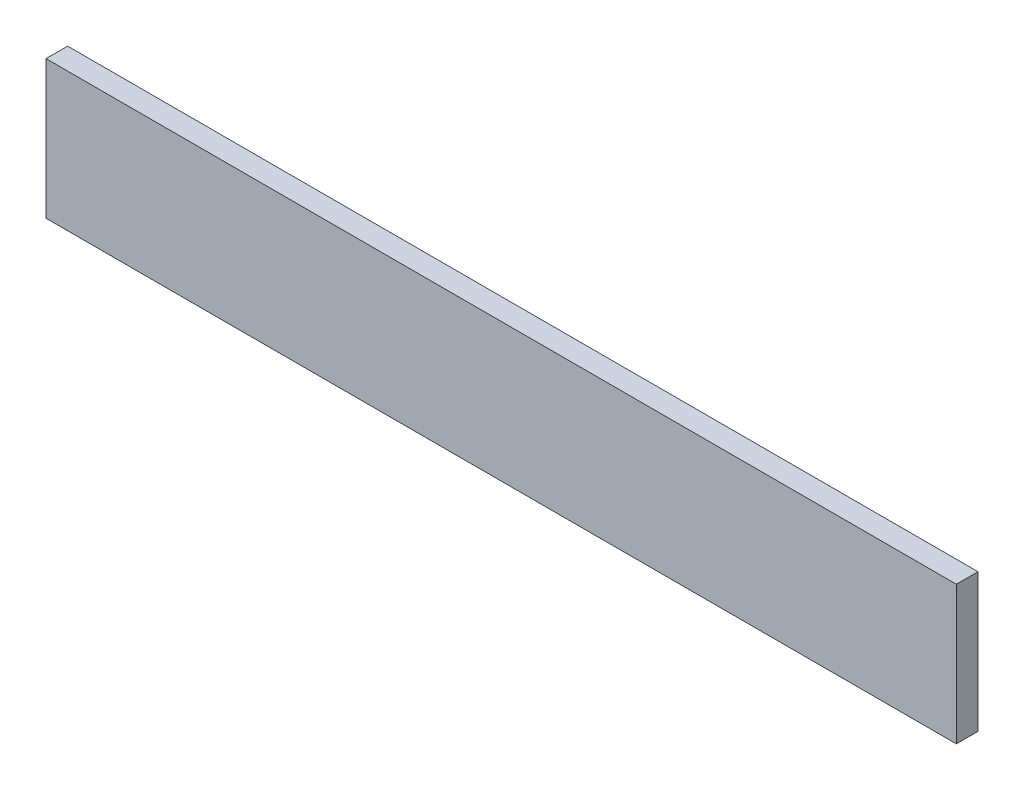
ISO-10303-21;
HEADER;
FILE_DESCRIPTION(('STEP AP214'),'2;1');
FILE_NAME('part.step','',(''),(''),'','','');
FILE_SCHEMA(('AUTOMOTIVE_DESIGN { 1 0 10303 214 1 1 1 1 }'));
ENDSEC;
DATA;
#1=APPLICATION_CONTEXT('core data for automotive mechanical design processes');
#2=APPLICATION_PROTOCOL_DEFINITION('international standard','automotive_design',2000,#1);
#3=PRODUCT_CONTEXT('',#1,'mechanical');
#4=PRODUCT('Part','Part','',(#3));
#5=PRODUCT_RELATED_PRODUCT_CATEGORY('part','',(#4));
#6=PRODUCT_DEFINITION_FORMATION('','',#4);
#7=PRODUCT_DEFINITION_CONTEXT('part definition',#1,'design');
#8=PRODUCT_DEFINITION('design','',#6,#7);
#9=PRODUCT_DEFINITION_SHAPE('','',#8);
#10=(LENGTH_UNIT() NAMED_UNIT(*) SI_UNIT(.MILLI.,.METRE.));
#11=(NAMED_UNIT(*) PLANE_ANGLE_UNIT() SI_UNIT($,.RADIAN.));
#12=(NAMED_UNIT(*) SI_UNIT($,.STERADIAN.) SOLID_ANGLE_UNIT());
#13=UNCERTAINTY_MEASURE_WITH_UNIT(LENGTH_MEASURE(1.E-05),#10,'distance_accuracy_value','');
#14=(GEOMETRIC_REPRESENTATION_CONTEXT(3) GLOBAL_UNCERTAINTY_ASSIGNED_CONTEXT((#13)) GLOBAL_UNIT_ASSIGNED_CONTEXT((#10,
#11,#12)) REPRESENTATION_CONTEXT('',''));
#15=CARTESIAN_POINT('',(0.,0.,0.));
#16=DIRECTION('',(0.,0.,1.));
#17=DIRECTION('',(1.,0.,0.));
#18=AXIS2_PLACEMENT_3D('',#15,#16,#17);
#19=CARTESIAN_POINT('',(378.575,-57.5,18.));
#20=DIRECTION('',(-1.,0.,0.));
#21=DIRECTION('',(0.,0.,1.));
#22=AXIS2_PLACEMENT_3D('',#19,#20,#21);
#23=PLANE('',#22);
#24=DIRECTION('',(0.,1.,0.));
#25=VECTOR('',#24,1.);
#26=CARTESIAN_POINT('',(378.575,-57.5,0.));
#27=LINE('',#26,#25);
#28=CARTESIAN_POINT('',(378.575,-57.5,0.));
#29=VERTEX_POINT('',#28);
#30=CARTESIAN_POINT('',(378.575,57.5,0.));
#31=VERTEX_POINT('',#30);
#32=EDGE_CURVE('E107',#29,#31,#27,.T.);
#33=ORIENTED_EDGE('',*,*,#32,.T.);
#34=DIRECTION('',(0.,0.,-1.));
#35=VECTOR('',#34,1.);
#36=CARTESIAN_POINT('',(378.575,57.5,18.));
#37=LINE('',#36,#35);
#38=CARTESIAN_POINT('',(378.575,57.5,18.));
#39=VERTEX_POINT('',#38);
#40=EDGE_CURVE('E11',#39,#31,#37,.T.);
#41=ORIENTED_EDGE('',*,*,#40,.F.);
#42=DIRECTION('',(0.,1.,0.));
#43=VECTOR('',#42,1.);
#44=CARTESIAN_POINT('',(378.575,-57.5,18.));
#45=LINE('',#44,#43);
#46=CARTESIAN_POINT('',(378.575,-57.5,18.));
#47=VERTEX_POINT('',#46);
#48=EDGE_CURVE('E91',#47,#39,#45,.T.);
#49=ORIENTED_EDGE('',*,*,#48,.F.);
#50=DIRECTION('',(0.,0.,-1.));
#51=VECTOR('',#50,1.);
#52=CARTESIAN_POINT('',(378.575,-57.5,18.));
#53=LINE('',#52,#51);
#54=EDGE_CURVE('E103',#47,#29,#53,.T.);
#55=ORIENTED_EDGE('',*,*,#54,.T.);
#56=EDGE_LOOP('',(#33,#41,#49,#55));
#57=FACE_BOUND('',#56,.T.);
#58=ADVANCED_FACE('F39',(#57),#23,.F.);
#59=CARTESIAN_POINT('',(-378.575,57.5,18.));
#60=DIRECTION('',(0.,-1.,0.));
#61=DIRECTION('',(0.,0.,-1.));
#62=AXIS2_PLACEMENT_3D('',#59,#60,#61);
#63=PLANE('',#62);
#64=DIRECTION('',(-1.,0.,0.));
#65=VECTOR('',#64,1.);
#66=CARTESIAN_POINT('',(-378.575,57.5,0.));
#67=LINE('',#66,#65);
#68=CARTESIAN_POINT('',(-378.575,57.5,0.));
#69=VERTEX_POINT('',#68);
#70=EDGE_CURVE('E96',#31,#69,#67,.T.);
#71=ORIENTED_EDGE('',*,*,#70,.T.);
#72=DIRECTION('',(0.,0.,-1.));
#73=VECTOR('',#72,1.);
#74=CARTESIAN_POINT('',(-378.575,57.5,18.));
#75=LINE('',#74,#73);
#76=CARTESIAN_POINT('',(-378.575,57.5,18.));
#77=VERTEX_POINT('',#76);
#78=EDGE_CURVE('E48',#77,#69,#75,.T.);
#79=ORIENTED_EDGE('',*,*,#78,.F.);
#80=DIRECTION('',(-1.,0.,0.));
#81=VECTOR('',#80,1.);
#82=CARTESIAN_POINT('',(-378.575,57.5,18.));
#83=LINE('',#82,#81);
#84=EDGE_CURVE('E86',#39,#77,#83,.T.);
#85=ORIENTED_EDGE('',*,*,#84,.F.);
#86=ORIENTED_EDGE('',*,*,#40,.T.);
#87=EDGE_LOOP('',(#71,#79,#85,#86));
#88=FACE_BOUND('',#87,.T.);
#89=ADVANCED_FACE('F95',(#88),#63,.F.);
#90=CARTESIAN_POINT('',(-378.575,-57.5,18.));
#91=DIRECTION('',(1.,0.,0.));
#92=DIRECTION('',(0.,0.,-1.));
#93=AXIS2_PLACEMENT_3D('',#90,#91,#92);
#94=PLANE('',#93);
#95=DIRECTION('',(0.,-1.,0.));
#96=VECTOR('',#95,1.);
#97=CARTESIAN_POINT('',(-378.575,-57.5,0.));
#98=LINE('',#97,#96);
#99=CARTESIAN_POINT('',(-378.575,-57.5,0.));
#100=VERTEX_POINT('',#99);
#101=EDGE_CURVE('E73',#69,#100,#98,.T.);
#102=ORIENTED_EDGE('',*,*,#101,.T.);
#103=DIRECTION('',(0.,0.,-1.));
#104=VECTOR('',#103,1.);
#105=CARTESIAN_POINT('',(-378.575,-57.5,18.));
#106=LINE('',#105,#104);
#107=CARTESIAN_POINT('',(-378.575,-57.5,18.));
#108=VERTEX_POINT('',#107);
#109=EDGE_CURVE('E98',#108,#100,#106,.T.);
#110=ORIENTED_EDGE('',*,*,#109,.F.);
#111=DIRECTION('',(0.,-1.,0.));
#112=VECTOR('',#111,1.);
#113=CARTESIAN_POINT('',(-378.575,-57.5,18.));
#114=LINE('',#113,#112);
#115=EDGE_CURVE('E89',#77,#108,#114,.T.);
#116=ORIENTED_EDGE('',*,*,#115,.F.);
#117=ORIENTED_EDGE('',*,*,#78,.T.);
#118=EDGE_LOOP('',(#102,#110,#116,#117));
#119=FACE_BOUND('',#118,.T.);
#120=ADVANCED_FACE('F99',(#119),#94,.F.);
#121=CARTESIAN_POINT('',(-378.575,-57.5,18.));
#122=DIRECTION('',(0.,1.,0.));
#123=DIRECTION('',(0.,0.,1.));
#124=AXIS2_PLACEMENT_3D('',#121,#122,#123);
#125=PLANE('',#124);
#126=DIRECTION('',(1.,0.,0.));
#127=VECTOR('',#126,1.);
#128=CARTESIAN_POINT('',(-378.575,-57.5,0.));
#129=LINE('',#128,#127);
#130=EDGE_CURVE('E79',#100,#29,#129,.T.);
#131=ORIENTED_EDGE('',*,*,#130,.T.);
#132=ORIENTED_EDGE('',*,*,#54,.F.);
#133=DIRECTION('',(1.,0.,0.));
#134=VECTOR('',#133,1.);
#135=CARTESIAN_POINT('',(-378.575,-57.5,18.));
#136=LINE('',#135,#134);
#137=EDGE_CURVE('E56',#108,#47,#136,.T.);
#138=ORIENTED_EDGE('',*,*,#137,.F.);
#139=ORIENTED_EDGE('',*,*,#109,.T.);
#140=EDGE_LOOP('',(#131,#132,#138,#139));
#141=FACE_BOUND('',#140,.T.);
#142=ADVANCED_FACE('F120',(#141),#125,.F.);
#143=CARTESIAN_POINT('',(0.,0.,18.));
#144=DIRECTION('',(0.,0.,-1.));
#145=DIRECTION('',(-1.,0.,0.));
#146=AXIS2_PLACEMENT_3D('',#143,#144,#145);
#147=PLANE('',#146);
#148=ORIENTED_EDGE('',*,*,#48,.T.);
#149=ORIENTED_EDGE('',*,*,#84,.T.);
#150=ORIENTED_EDGE('',*,*,#115,.T.);
#151=ORIENTED_EDGE('',*,*,#137,.T.);
#152=EDGE_LOOP('',(#148,#149,#150,#151));
#153=FACE_BOUND('',#152,.T.);
#154=ADVANCED_FACE('F87',(#153),#147,.F.);
#155=CARTESIAN_POINT('',(0.,0.,0.));
#156=DIRECTION('',(0.,0.,-1.));
#157=DIRECTION('',(-1.,0.,0.));
#158=AXIS2_PLACEMENT_3D('',#155,#156,#157);
#159=PLANE('',#158);
#160=ORIENTED_EDGE('',*,*,#32,.F.);
#161=ORIENTED_EDGE('',*,*,#130,.F.);
#162=ORIENTED_EDGE('',*,*,#101,.F.);
#163=ORIENTED_EDGE('',*,*,#70,.F.);
#164=EDGE_LOOP('',(#160,#161,#162,#163));
#165=FACE_BOUND('',#164,.T.);
#166=ADVANCED_FACE('F123',(#165),#159,.T.);
#167=CLOSED_SHELL('',(#58,#89,#120,#142,#154,#166));
#168=MANIFOLD_SOLID_BREP('B2',#167);
#169=ADVANCED_BREP_SHAPE_REPRESENTATION('',(#18,#168),#14);
#170=SHAPE_DEFINITION_REPRESENTATION(#9,#169);
ENDSEC;
END-ISO-10303-21;
